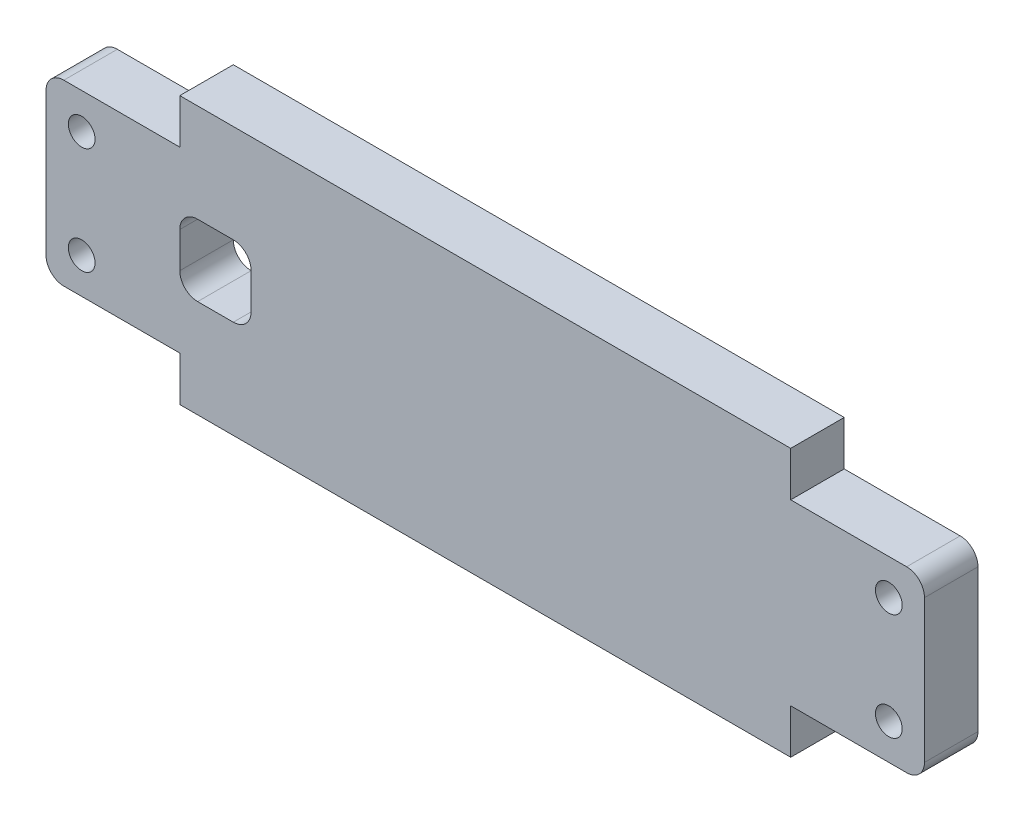
ISO-10303-21;
HEADER;
FILE_DESCRIPTION(('STEP AP214'),'2;1');
FILE_NAME('part.step','',(''),(''),'','','');
FILE_SCHEMA(('AUTOMOTIVE_DESIGN { 1 0 10303 214 1 1 1 1 }'));
ENDSEC;
DATA;
#1=APPLICATION_CONTEXT('core data for automotive mechanical design processes');
#2=APPLICATION_PROTOCOL_DEFINITION('international standard','automotive_design',2000,#1);
#3=PRODUCT_CONTEXT('',#1,'mechanical');
#4=PRODUCT('Part','Part','',(#3));
#5=PRODUCT_RELATED_PRODUCT_CATEGORY('part','',(#4));
#6=PRODUCT_DEFINITION_FORMATION('','',#4);
#7=PRODUCT_DEFINITION_CONTEXT('part definition',#1,'design');
#8=PRODUCT_DEFINITION('design','',#6,#7);
#9=PRODUCT_DEFINITION_SHAPE('','',#8);
#10=(LENGTH_UNIT() NAMED_UNIT(*) SI_UNIT(.MILLI.,.METRE.));
#11=(NAMED_UNIT(*) PLANE_ANGLE_UNIT() SI_UNIT($,.RADIAN.));
#12=(NAMED_UNIT(*) SI_UNIT($,.STERADIAN.) SOLID_ANGLE_UNIT());
#13=UNCERTAINTY_MEASURE_WITH_UNIT(LENGTH_MEASURE(1.E-05),#10,'distance_accuracy_value','');
#14=(GEOMETRIC_REPRESENTATION_CONTEXT(3) GLOBAL_UNCERTAINTY_ASSIGNED_CONTEXT((#13)) GLOBAL_UNIT_ASSIGNED_CONTEXT((#10,
#11,#12)) REPRESENTATION_CONTEXT('',''));
#15=CARTESIAN_POINT('',(0.,0.,0.));
#16=DIRECTION('',(0.,0.,1.));
#17=DIRECTION('',(1.,0.,0.));
#18=AXIS2_PLACEMENT_3D('',#15,#16,#17);
#19=CARTESIAN_POINT('',(0.,0.,3.));
#20=DIRECTION('',(0.,0.,1.));
#21=DIRECTION('',(1.,0.,0.));
#22=AXIS2_PLACEMENT_3D('',#19,#20,#21);
#23=PLANE('',#22);
#24=CARTESIAN_POINT('',(-45.25,6.,3.));
#25=DIRECTION('',(0.,0.,-1.));
#26=DIRECTION('',(-1.,0.,0.));
#27=AXIS2_PLACEMENT_3D('',#24,#25,#26);
#28=CIRCLE('',#27,1.5);
#29=CARTESIAN_POINT('',(-43.75,6.,3.));
#30=VERTEX_POINT('',#29);
#31=EDGE_CURVE('E266',#30,#30,#28,.T.);
#32=ORIENTED_EDGE('',*,*,#31,.T.);
#33=EDGE_LOOP('',(#32));
#34=FACE_BOUND('',#33,.T.);
#35=CARTESIAN_POINT('',(-45.25,-6.,3.));
#36=DIRECTION('',(0.,0.,-1.));
#37=DIRECTION('',(-1.,0.,0.));
#38=AXIS2_PLACEMENT_3D('',#35,#36,#37);
#39=CIRCLE('',#38,1.5);
#40=CARTESIAN_POINT('',(-43.75,-6.,3.));
#41=VERTEX_POINT('',#40);
#42=EDGE_CURVE('E251',#41,#41,#39,.T.);
#43=ORIENTED_EDGE('',*,*,#42,.T.);
#44=EDGE_LOOP('',(#43));
#45=FACE_BOUND('',#44,.T.);
#46=CARTESIAN_POINT('',(45.25,-6.,3.));
#47=DIRECTION('',(0.,0.,-1.));
#48=DIRECTION('',(-1.,0.,0.));
#49=AXIS2_PLACEMENT_3D('',#46,#47,#48);
#50=CIRCLE('',#49,1.5);
#51=CARTESIAN_POINT('',(46.75,-6.,3.));
#52=VERTEX_POINT('',#51);
#53=EDGE_CURVE('E255',#52,#52,#50,.T.);
#54=ORIENTED_EDGE('',*,*,#53,.T.);
#55=EDGE_LOOP('',(#54));
#56=FACE_BOUND('',#55,.T.);
#57=CARTESIAN_POINT('',(45.25,6.,3.));
#58=DIRECTION('',(0.,0.,-1.));
#59=DIRECTION('',(-1.,0.,0.));
#60=AXIS2_PLACEMENT_3D('',#57,#58,#59);
#61=CIRCLE('',#60,1.5);
#62=CARTESIAN_POINT('',(46.75,6.,3.));
#63=VERTEX_POINT('',#62);
#64=EDGE_CURVE('E392',#63,#63,#61,.T.);
#65=ORIENTED_EDGE('',*,*,#64,.T.);
#66=EDGE_LOOP('',(#65));
#67=FACE_BOUND('',#66,.T.);
#68=DIRECTION('',(0.,1.,0.));
#69=VECTOR('',#68,1.);
#70=CARTESIAN_POINT('',(-34.25,2.,3.));
#71=LINE('',#70,#69);
#72=CARTESIAN_POINT('',(-34.25,-2.,3.));
#73=VERTEX_POINT('',#72);
#74=CARTESIAN_POINT('',(-34.25,2.,3.));
#75=VERTEX_POINT('',#74);
#76=EDGE_CURVE('E424',#73,#75,#71,.T.);
#77=ORIENTED_EDGE('',*,*,#76,.T.);
#78=CARTESIAN_POINT('',(-32.25,2.,3.));
#79=DIRECTION('',(0.,0.,1.));
#80=DIRECTION('',(-0.707106781186548,0.707106781186547,0.));
#81=AXIS2_PLACEMENT_3D('',#78,#79,#80);
#82=CIRCLE('',#81,2.);
#83=CARTESIAN_POINT('',(-32.25,4.,3.));
#84=VERTEX_POINT('',#83);
#85=EDGE_CURVE('E281',#84,#75,#82,.T.);
#86=ORIENTED_EDGE('',*,*,#85,.F.);
#87=DIRECTION('',(1.,0.,0.));
#88=VECTOR('',#87,1.);
#89=CARTESIAN_POINT('',(-13.125,4.,3.));
#90=LINE('',#89,#88);
#91=CARTESIAN_POINT('',(-28.25,4.,3.));
#92=VERTEX_POINT('',#91);
#93=EDGE_CURVE('E389',#84,#92,#90,.T.);
#94=ORIENTED_EDGE('',*,*,#93,.T.);
#95=CARTESIAN_POINT('',(-28.25,2.,3.));
#96=DIRECTION('',(0.,0.,1.));
#97=DIRECTION('',(0.707106781186548,0.707106781186547,0.));
#98=AXIS2_PLACEMENT_3D('',#95,#96,#97);
#99=CIRCLE('',#98,2.);
#100=CARTESIAN_POINT('',(-26.25,2.,3.));
#101=VERTEX_POINT('',#100);
#102=EDGE_CURVE('E351',#101,#92,#99,.T.);
#103=ORIENTED_EDGE('',*,*,#102,.F.);
#104=DIRECTION('',(0.,-1.,0.));
#105=VECTOR('',#104,1.);
#106=CARTESIAN_POINT('',(-26.25,-2.,3.));
#107=LINE('',#106,#105);
#108=CARTESIAN_POINT('',(-26.25,-2.,3.));
#109=VERTEX_POINT('',#108);
#110=EDGE_CURVE('E275',#101,#109,#107,.T.);
#111=ORIENTED_EDGE('',*,*,#110,.T.);
#112=CARTESIAN_POINT('',(-28.25,-2.,3.));
#113=DIRECTION('',(0.,0.,1.));
#114=DIRECTION('',(0.707106781186548,-0.707106781186547,0.));
#115=AXIS2_PLACEMENT_3D('',#112,#113,#114);
#116=CIRCLE('',#115,2.);
#117=CARTESIAN_POINT('',(-28.25,-4.,3.));
#118=VERTEX_POINT('',#117);
#119=EDGE_CURVE('E352',#118,#109,#116,.T.);
#120=ORIENTED_EDGE('',*,*,#119,.F.);
#121=DIRECTION('',(-1.,0.,0.));
#122=VECTOR('',#121,1.);
#123=CARTESIAN_POINT('',(-17.125,-4.,3.));
#124=LINE('',#123,#122);
#125=CARTESIAN_POINT('',(-32.25,-4.,3.));
#126=VERTEX_POINT('',#125);
#127=EDGE_CURVE('E282',#118,#126,#124,.T.);
#128=ORIENTED_EDGE('',*,*,#127,.T.);
#129=CARTESIAN_POINT('',(-32.25,-2.,3.));
#130=DIRECTION('',(0.,0.,1.));
#131=DIRECTION('',(-0.707106781186548,-0.707106781186547,0.));
#132=AXIS2_PLACEMENT_3D('',#129,#130,#131);
#133=CIRCLE('',#132,2.);
#134=EDGE_CURVE('E388',#73,#126,#133,.T.);
#135=ORIENTED_EDGE('',*,*,#134,.F.);
#136=EDGE_LOOP('',(#77,#86,#94,#103,#111,#120,#128,#135));
#137=FACE_BOUND('',#136,.T.);
#138=CARTESIAN_POINT('',(47.25,8.,3.));
#139=DIRECTION('',(0.,0.,-1.));
#140=DIRECTION('',(0.70710678118655,0.707106781186545,0.));
#141=AXIS2_PLACEMENT_3D('',#138,#139,#140);
#142=CIRCLE('',#141,2.);
#143=CARTESIAN_POINT('',(47.25,10.,3.));
#144=VERTEX_POINT('',#143);
#145=CARTESIAN_POINT('',(49.25,8.,3.));
#146=VERTEX_POINT('',#145);
#147=EDGE_CURVE('E309',#144,#146,#142,.T.);
#148=ORIENTED_EDGE('',*,*,#147,.F.);
#149=DIRECTION('',(-1.,0.,0.));
#150=VECTOR('',#149,1.);
#151=CARTESIAN_POINT('',(49.25,10.,3.));
#152=LINE('',#151,#150);
#153=CARTESIAN_POINT('',(34.25,10.,3.));
#154=VERTEX_POINT('',#153);
#155=EDGE_CURVE('E445',#144,#154,#152,.T.);
#156=ORIENTED_EDGE('',*,*,#155,.T.);
#157=DIRECTION('',(0.,1.,0.));
#158=VECTOR('',#157,1.);
#159=CARTESIAN_POINT('',(34.25,-15.,3.));
#160=LINE('',#159,#158);
#161=CARTESIAN_POINT('',(34.25,15.,3.));
#162=VERTEX_POINT('',#161);
#163=EDGE_CURVE('E313',#154,#162,#160,.T.);
#164=ORIENTED_EDGE('',*,*,#163,.T.);
#165=DIRECTION('',(-1.,0.,0.));
#166=VECTOR('',#165,1.);
#167=CARTESIAN_POINT('',(34.25,15.,3.));
#168=LINE('',#167,#166);
#169=CARTESIAN_POINT('',(-34.25,15.,3.));
#170=VERTEX_POINT('',#169);
#171=EDGE_CURVE('E497',#162,#170,#168,.T.);
#172=ORIENTED_EDGE('',*,*,#171,.T.);
#173=DIRECTION('',(0.,-1.,0.));
#174=VECTOR('',#173,1.);
#175=CARTESIAN_POINT('',(-34.25,15.,3.));
#176=LINE('',#175,#174);
#177=CARTESIAN_POINT('',(-34.25,10.,3.));
#178=VERTEX_POINT('',#177);
#179=EDGE_CURVE('E462',#170,#178,#176,.T.);
#180=ORIENTED_EDGE('',*,*,#179,.T.);
#181=DIRECTION('',(-1.,0.,0.));
#182=VECTOR('',#181,1.);
#183=CARTESIAN_POINT('',(-34.25,10.,3.));
#184=LINE('',#183,#182);
#185=CARTESIAN_POINT('',(-47.25,10.,3.));
#186=VERTEX_POINT('',#185);
#187=EDGE_CURVE('E287',#178,#186,#184,.T.);
#188=ORIENTED_EDGE('',*,*,#187,.T.);
#189=CARTESIAN_POINT('',(-47.25,8.,3.));
#190=DIRECTION('',(0.,0.,-1.));
#191=DIRECTION('',(-0.70710678118655,0.707106781186545,0.));
#192=AXIS2_PLACEMENT_3D('',#189,#190,#191);
#193=CIRCLE('',#192,2.);
#194=CARTESIAN_POINT('',(-49.25,8.,3.));
#195=VERTEX_POINT('',#194);
#196=EDGE_CURVE('E307',#195,#186,#193,.T.);
#197=ORIENTED_EDGE('',*,*,#196,.F.);
#198=DIRECTION('',(0.,-1.,0.));
#199=VECTOR('',#198,1.);
#200=CARTESIAN_POINT('',(-49.25,10.,3.));
#201=LINE('',#200,#199);
#202=CARTESIAN_POINT('',(-49.25,-8.,3.));
#203=VERTEX_POINT('',#202);
#204=EDGE_CURVE('E308',#195,#203,#201,.T.);
#205=ORIENTED_EDGE('',*,*,#204,.T.);
#206=CARTESIAN_POINT('',(-47.25,-8.,3.));
#207=DIRECTION('',(0.,0.,-1.));
#208=DIRECTION('',(-0.707106781186546,-0.707106781186549,0.));
#209=AXIS2_PLACEMENT_3D('',#206,#207,#208);
#210=CIRCLE('',#209,2.);
#211=CARTESIAN_POINT('',(-47.25,-10.,3.));
#212=VERTEX_POINT('',#211);
#213=EDGE_CURVE('E367',#212,#203,#210,.T.);
#214=ORIENTED_EDGE('',*,*,#213,.F.);
#215=DIRECTION('',(1.,0.,0.));
#216=VECTOR('',#215,1.);
#217=CARTESIAN_POINT('',(-49.25,-10.,3.));
#218=LINE('',#217,#216);
#219=CARTESIAN_POINT('',(-34.25,-10.,3.));
#220=VERTEX_POINT('',#219);
#221=EDGE_CURVE('E10',#212,#220,#218,.T.);
#222=ORIENTED_EDGE('',*,*,#221,.T.);
#223=DIRECTION('',(0.,-1.,0.));
#224=VECTOR('',#223,1.);
#225=CARTESIAN_POINT('',(-34.25,15.,3.));
#226=LINE('',#225,#224);
#227=CARTESIAN_POINT('',(-34.25,-15.,3.));
#228=VERTEX_POINT('',#227);
#229=EDGE_CURVE('E47',#220,#228,#226,.T.);
#230=ORIENTED_EDGE('',*,*,#229,.T.);
#231=DIRECTION('',(1.,0.,0.));
#232=VECTOR('',#231,1.);
#233=CARTESIAN_POINT('',(-34.25,-15.,3.));
#234=LINE('',#233,#232);
#235=CARTESIAN_POINT('',(34.25,-15.,3.));
#236=VERTEX_POINT('',#235);
#237=EDGE_CURVE('E396',#228,#236,#234,.T.);
#238=ORIENTED_EDGE('',*,*,#237,.T.);
#239=DIRECTION('',(0.,1.,0.));
#240=VECTOR('',#239,1.);
#241=CARTESIAN_POINT('',(34.25,-15.,3.));
#242=LINE('',#241,#240);
#243=CARTESIAN_POINT('',(34.25,-10.,3.));
#244=VERTEX_POINT('',#243);
#245=EDGE_CURVE('E328',#236,#244,#242,.T.);
#246=ORIENTED_EDGE('',*,*,#245,.T.);
#247=DIRECTION('',(1.,0.,0.));
#248=VECTOR('',#247,1.);
#249=CARTESIAN_POINT('',(34.25,-10.,3.));
#250=LINE('',#249,#248);
#251=CARTESIAN_POINT('',(47.25,-10.,3.));
#252=VERTEX_POINT('',#251);
#253=EDGE_CURVE('E372',#244,#252,#250,.T.);
#254=ORIENTED_EDGE('',*,*,#253,.T.);
#255=CARTESIAN_POINT('',(47.25,-8.,3.));
#256=DIRECTION('',(0.,0.,-1.));
#257=DIRECTION('',(0.707106781186546,-0.707106781186549,0.));
#258=AXIS2_PLACEMENT_3D('',#255,#256,#257);
#259=CIRCLE('',#258,2.);
#260=CARTESIAN_POINT('',(49.25,-8.,3.));
#261=VERTEX_POINT('',#260);
#262=EDGE_CURVE('E270',#261,#252,#259,.T.);
#263=ORIENTED_EDGE('',*,*,#262,.F.);
#264=DIRECTION('',(0.,1.,0.));
#265=VECTOR('',#264,1.);
#266=CARTESIAN_POINT('',(49.25,-10.,3.));
#267=LINE('',#266,#265);
#268=EDGE_CURVE('E414',#261,#146,#267,.T.);
#269=ORIENTED_EDGE('',*,*,#268,.T.);
#270=EDGE_LOOP('',(#148,#156,#164,#172,#180,#188,#197,#205,#214,#222,#230,#238,#246,#254,#263,#269));
#271=FACE_BOUND('',#270,.T.);
#272=ADVANCED_FACE('F16',(#34,#45,#56,#67,#137,#271),#23,.T.);
#273=CARTESIAN_POINT('',(-49.25,-10.,0.));
#274=DIRECTION('',(0.,-1.,0.));
#275=DIRECTION('',(0.,0.,-1.));
#276=AXIS2_PLACEMENT_3D('',#273,#274,#275);
#277=PLANE('',#276);
#278=DIRECTION('',(0.,0.,1.));
#279=VECTOR('',#278,1.);
#280=CARTESIAN_POINT('',(-47.25,-10.,0.));
#281=LINE('',#280,#279);
#282=CARTESIAN_POINT('',(-47.25,-10.,-3.));
#283=VERTEX_POINT('',#282);
#284=EDGE_CURVE('E363',#283,#212,#281,.T.);
#285=ORIENTED_EDGE('',*,*,#284,.F.);
#286=DIRECTION('',(-1.,0.,0.));
#287=VECTOR('',#286,1.);
#288=CARTESIAN_POINT('',(-49.25,-10.,-3.));
#289=LINE('',#288,#287);
#290=CARTESIAN_POINT('',(-34.25,-10.,-3.));
#291=VERTEX_POINT('',#290);
#292=EDGE_CURVE('E337',#291,#283,#289,.T.);
#293=ORIENTED_EDGE('',*,*,#292,.F.);
#294=DIRECTION('',(0.,0.,1.));
#295=VECTOR('',#294,1.);
#296=CARTESIAN_POINT('',(-34.25,-10.,0.));
#297=LINE('',#296,#295);
#298=EDGE_CURVE('E26',#291,#220,#297,.T.);
#299=ORIENTED_EDGE('',*,*,#298,.T.);
#300=ORIENTED_EDGE('',*,*,#221,.F.);
#301=EDGE_LOOP('',(#285,#293,#299,#300));
#302=FACE_BOUND('',#301,.T.);
#303=ADVANCED_FACE('F568',(#302),#277,.T.);
#304=CARTESIAN_POINT('',(-34.25,-10.,0.));
#305=DIRECTION('',(-1.,0.,0.));
#306=DIRECTION('',(0.,1.,0.));
#307=AXIS2_PLACEMENT_3D('',#304,#305,#306);
#308=PLANE('',#307);
#309=DIRECTION('',(0.,0.,1.));
#310=VECTOR('',#309,1.);
#311=CARTESIAN_POINT('',(-34.25,-15.,0.));
#312=LINE('',#311,#310);
#313=CARTESIAN_POINT('',(-34.25,-15.,-3.));
#314=VERTEX_POINT('',#313);
#315=EDGE_CURVE('E405',#314,#228,#312,.T.);
#316=ORIENTED_EDGE('',*,*,#315,.T.);
#317=ORIENTED_EDGE('',*,*,#229,.F.);
#318=ORIENTED_EDGE('',*,*,#298,.F.);
#319=DIRECTION('',(0.,1.,0.));
#320=VECTOR('',#319,1.);
#321=CARTESIAN_POINT('',(-34.25,15.,-3.));
#322=LINE('',#321,#320);
#323=EDGE_CURVE('E342',#314,#291,#322,.T.);
#324=ORIENTED_EDGE('',*,*,#323,.F.);
#325=EDGE_LOOP('',(#316,#317,#318,#324));
#326=FACE_BOUND('',#325,.T.);
#327=ADVANCED_FACE('F574',(#326),#308,.T.);
#328=CARTESIAN_POINT('',(-34.25,-15.,0.));
#329=DIRECTION('',(0.,-1.,0.));
#330=DIRECTION('',(-1.,0.,0.));
#331=AXIS2_PLACEMENT_3D('',#328,#329,#330);
#332=PLANE('',#331);
#333=DIRECTION('',(0.,0.,1.));
#334=VECTOR('',#333,1.);
#335=CARTESIAN_POINT('',(34.25,-15.,0.));
#336=LINE('',#335,#334);
#337=CARTESIAN_POINT('',(34.25,-15.,-3.));
#338=VERTEX_POINT('',#337);
#339=EDGE_CURVE('E332',#338,#236,#336,.T.);
#340=ORIENTED_EDGE('',*,*,#339,.T.);
#341=ORIENTED_EDGE('',*,*,#237,.F.);
#342=ORIENTED_EDGE('',*,*,#315,.F.);
#343=DIRECTION('',(-1.,0.,0.));
#344=VECTOR('',#343,1.);
#345=CARTESIAN_POINT('',(-34.25,-15.,-3.));
#346=LINE('',#345,#344);
#347=EDGE_CURVE('E413',#338,#314,#346,.T.);
#348=ORIENTED_EDGE('',*,*,#347,.F.);
#349=EDGE_LOOP('',(#340,#341,#342,#348));
#350=FACE_BOUND('',#349,.T.);
#351=ADVANCED_FACE('F640',(#350),#332,.T.);
#352=CARTESIAN_POINT('',(34.25,-15.,0.));
#353=DIRECTION('',(1.,0.,0.));
#354=DIRECTION('',(0.,1.,0.));
#355=AXIS2_PLACEMENT_3D('',#352,#353,#354);
#356=PLANE('',#355);
#357=DIRECTION('',(0.,0.,1.));
#358=VECTOR('',#357,1.);
#359=CARTESIAN_POINT('',(34.25,-10.,0.));
#360=LINE('',#359,#358);
#361=CARTESIAN_POINT('',(34.25,-10.,-3.));
#362=VERTEX_POINT('',#361);
#363=EDGE_CURVE('E333',#362,#244,#360,.T.);
#364=ORIENTED_EDGE('',*,*,#363,.T.);
#365=ORIENTED_EDGE('',*,*,#245,.F.);
#366=ORIENTED_EDGE('',*,*,#339,.F.);
#367=DIRECTION('',(0.,-1.,0.));
#368=VECTOR('',#367,1.);
#369=CARTESIAN_POINT('',(34.25,-15.,-3.));
#370=LINE('',#369,#368);
#371=EDGE_CURVE('E20',#362,#338,#370,.T.);
#372=ORIENTED_EDGE('',*,*,#371,.F.);
#373=EDGE_LOOP('',(#364,#365,#366,#372));
#374=FACE_BOUND('',#373,.T.);
#375=ADVANCED_FACE('F690',(#374),#356,.T.);
#376=CARTESIAN_POINT('',(34.25,-10.,0.));
#377=DIRECTION('',(0.,-1.,0.));
#378=DIRECTION('',(-1.,0.,0.));
#379=AXIS2_PLACEMENT_3D('',#376,#377,#378);
#380=PLANE('',#379);
#381=DIRECTION('',(0.,0.,-1.));
#382=VECTOR('',#381,1.);
#383=CARTESIAN_POINT('',(47.25,-10.,0.));
#384=LINE('',#383,#382);
#385=CARTESIAN_POINT('',(47.25,-10.,-3.));
#386=VERTEX_POINT('',#385);
#387=EDGE_CURVE('E368',#252,#386,#384,.T.);
#388=ORIENTED_EDGE('',*,*,#387,.F.);
#389=ORIENTED_EDGE('',*,*,#253,.F.);
#390=ORIENTED_EDGE('',*,*,#363,.F.);
#391=DIRECTION('',(-1.,0.,0.));
#392=VECTOR('',#391,1.);
#393=CARTESIAN_POINT('',(34.25,-10.,-3.));
#394=LINE('',#393,#392);
#395=EDGE_CURVE('E409',#386,#362,#394,.T.);
#396=ORIENTED_EDGE('',*,*,#395,.F.);
#397=EDGE_LOOP('',(#388,#389,#390,#396));
#398=FACE_BOUND('',#397,.T.);
#399=ADVANCED_FACE('F18',(#398),#380,.T.);
#400=CARTESIAN_POINT('',(49.25,10.,0.));
#401=DIRECTION('',(0.,1.,0.));
#402=DIRECTION('',(1.,0.,0.));
#403=AXIS2_PLACEMENT_3D('',#400,#401,#402);
#404=PLANE('',#403);
#405=DIRECTION('',(0.,0.,1.));
#406=VECTOR('',#405,1.);
#407=CARTESIAN_POINT('',(47.25,10.,0.));
#408=LINE('',#407,#406);
#409=CARTESIAN_POINT('',(47.25,10.,-3.));
#410=VERTEX_POINT('',#409);
#411=EDGE_CURVE('E297',#410,#144,#408,.T.);
#412=ORIENTED_EDGE('',*,*,#411,.F.);
#413=DIRECTION('',(1.,0.,0.));
#414=VECTOR('',#413,1.);
#415=CARTESIAN_POINT('',(49.25,10.,-3.));
#416=LINE('',#415,#414);
#417=CARTESIAN_POINT('',(34.25,10.,-3.));
#418=VERTEX_POINT('',#417);
#419=EDGE_CURVE('E362',#418,#410,#416,.T.);
#420=ORIENTED_EDGE('',*,*,#419,.F.);
#421=DIRECTION('',(0.,0.,1.));
#422=VECTOR('',#421,1.);
#423=CARTESIAN_POINT('',(34.25,10.,0.));
#424=LINE('',#423,#422);
#425=EDGE_CURVE('E316',#418,#154,#424,.T.);
#426=ORIENTED_EDGE('',*,*,#425,.T.);
#427=ORIENTED_EDGE('',*,*,#155,.F.);
#428=EDGE_LOOP('',(#412,#420,#426,#427));
#429=FACE_BOUND('',#428,.T.);
#430=ADVANCED_FACE('F579',(#429),#404,.T.);
#431=CARTESIAN_POINT('',(34.25,10.,0.));
#432=DIRECTION('',(1.,0.,0.));
#433=DIRECTION('',(0.,1.,0.));
#434=AXIS2_PLACEMENT_3D('',#431,#432,#433);
#435=PLANE('',#434);
#436=DIRECTION('',(0.,0.,1.));
#437=VECTOR('',#436,1.);
#438=CARTESIAN_POINT('',(34.25,15.,0.));
#439=LINE('',#438,#437);
#440=CARTESIAN_POINT('',(34.25,15.,-3.));
#441=VERTEX_POINT('',#440);
#442=EDGE_CURVE('E317',#441,#162,#439,.T.);
#443=ORIENTED_EDGE('',*,*,#442,.T.);
#444=ORIENTED_EDGE('',*,*,#163,.F.);
#445=ORIENTED_EDGE('',*,*,#425,.F.);
#446=DIRECTION('',(0.,-1.,0.));
#447=VECTOR('',#446,1.);
#448=CARTESIAN_POINT('',(34.25,-15.,-3.));
#449=LINE('',#448,#447);
#450=EDGE_CURVE('E483',#441,#418,#449,.T.);
#451=ORIENTED_EDGE('',*,*,#450,.F.);
#452=EDGE_LOOP('',(#443,#444,#445,#451));
#453=FACE_BOUND('',#452,.T.);
#454=ADVANCED_FACE('F627',(#453),#435,.T.);
#455=CARTESIAN_POINT('',(34.25,15.,0.));
#456=DIRECTION('',(0.,1.,0.));
#457=DIRECTION('',(1.,0.,0.));
#458=AXIS2_PLACEMENT_3D('',#455,#456,#457);
#459=PLANE('',#458);
#460=DIRECTION('',(0.,0.,1.));
#461=VECTOR('',#460,1.);
#462=CARTESIAN_POINT('',(-34.25,15.,0.));
#463=LINE('',#462,#461);
#464=CARTESIAN_POINT('',(-34.25,15.,-3.));
#465=VERTEX_POINT('',#464);
#466=EDGE_CURVE('E465',#465,#170,#463,.T.);
#467=ORIENTED_EDGE('',*,*,#466,.T.);
#468=ORIENTED_EDGE('',*,*,#171,.F.);
#469=ORIENTED_EDGE('',*,*,#442,.F.);
#470=DIRECTION('',(1.,0.,0.));
#471=VECTOR('',#470,1.);
#472=CARTESIAN_POINT('',(34.25,15.,-3.));
#473=LINE('',#472,#471);
#474=EDGE_CURVE('E474',#465,#441,#473,.T.);
#475=ORIENTED_EDGE('',*,*,#474,.F.);
#476=EDGE_LOOP('',(#467,#468,#469,#475));
#477=FACE_BOUND('',#476,.T.);
#478=ADVANCED_FACE('F606',(#477),#459,.T.);
#479=CARTESIAN_POINT('',(-34.25,15.,0.));
#480=DIRECTION('',(-1.,0.,0.));
#481=DIRECTION('',(0.,1.,0.));
#482=AXIS2_PLACEMENT_3D('',#479,#480,#481);
#483=PLANE('',#482);
#484=DIRECTION('',(0.,0.,1.));
#485=VECTOR('',#484,1.);
#486=CARTESIAN_POINT('',(-34.25,10.,0.));
#487=LINE('',#486,#485);
#488=CARTESIAN_POINT('',(-34.25,10.,-3.));
#489=VERTEX_POINT('',#488);
#490=EDGE_CURVE('E290',#489,#178,#487,.T.);
#491=ORIENTED_EDGE('',*,*,#490,.T.);
#492=ORIENTED_EDGE('',*,*,#179,.F.);
#493=ORIENTED_EDGE('',*,*,#466,.F.);
#494=DIRECTION('',(0.,1.,0.));
#495=VECTOR('',#494,1.);
#496=CARTESIAN_POINT('',(-34.25,15.,-3.));
#497=LINE('',#496,#495);
#498=EDGE_CURVE('E471',#489,#465,#497,.T.);
#499=ORIENTED_EDGE('',*,*,#498,.F.);
#500=EDGE_LOOP('',(#491,#492,#493,#499));
#501=FACE_BOUND('',#500,.T.);
#502=ADVANCED_FACE('F602',(#501),#483,.T.);
#503=CARTESIAN_POINT('',(-34.25,10.,0.));
#504=DIRECTION('',(0.,1.,0.));
#505=DIRECTION('',(1.,0.,0.));
#506=AXIS2_PLACEMENT_3D('',#503,#504,#505);
#507=PLANE('',#506);
#508=DIRECTION('',(0.,0.,-1.));
#509=VECTOR('',#508,1.);
#510=CARTESIAN_POINT('',(-47.25,10.,0.));
#511=LINE('',#510,#509);
#512=CARTESIAN_POINT('',(-47.25,10.,-3.));
#513=VERTEX_POINT('',#512);
#514=EDGE_CURVE('E318',#186,#513,#511,.T.);
#515=ORIENTED_EDGE('',*,*,#514,.F.);
#516=ORIENTED_EDGE('',*,*,#187,.F.);
#517=ORIENTED_EDGE('',*,*,#490,.F.);
#518=DIRECTION('',(1.,0.,0.));
#519=VECTOR('',#518,1.);
#520=CARTESIAN_POINT('',(-34.25,10.,-3.));
#521=LINE('',#520,#519);
#522=EDGE_CURVE('E326',#513,#489,#521,.T.);
#523=ORIENTED_EDGE('',*,*,#522,.F.);
#524=EDGE_LOOP('',(#515,#516,#517,#523));
#525=FACE_BOUND('',#524,.T.);
#526=ADVANCED_FACE('F605',(#525),#507,.T.);
#527=CARTESIAN_POINT('',(45.25,6.,0.));
#528=DIRECTION('',(0.,0.,1.));
#529=DIRECTION('',(-1.,0.,0.));
#530=AXIS2_PLACEMENT_3D('',#527,#528,#529);
#531=CYLINDRICAL_SURFACE('',#530,1.5);
#532=ORIENTED_EDGE('',*,*,#64,.F.);
#533=DIRECTION('',(0.,0.,-1.));
#534=VECTOR('',#533,1.);
#535=CARTESIAN_POINT('',(46.75,6.,0.));
#536=LINE('',#535,#534);
#537=CARTESIAN_POINT('',(46.75,6.,-3.));
#538=VERTEX_POINT('',#537);
#539=EDGE_CURVE('E291',#63,#538,#536,.T.);
#540=ORIENTED_EDGE('',*,*,#539,.T.);
#541=CARTESIAN_POINT('',(45.25,6.,-3.));
#542=DIRECTION('',(0.,0.,1.));
#543=DIRECTION('',(-1.,0.,0.));
#544=AXIS2_PLACEMENT_3D('',#541,#542,#543);
#545=CIRCLE('',#544,1.5);
#546=EDGE_CURVE('E451',#538,#538,#545,.T.);
#547=ORIENTED_EDGE('',*,*,#546,.F.);
#548=ORIENTED_EDGE('',*,*,#539,.F.);
#549=EDGE_LOOP('',(#532,#540,#547,#548));
#550=FACE_BOUND('',#549,.T.);
#551=ADVANCED_FACE('F600',(#550),#531,.F.);
#552=CARTESIAN_POINT('',(45.25,-6.,0.));
#553=DIRECTION('',(0.,0.,1.));
#554=DIRECTION('',(-1.,0.,0.));
#555=AXIS2_PLACEMENT_3D('',#552,#553,#554);
#556=CYLINDRICAL_SURFACE('',#555,1.5);
#557=ORIENTED_EDGE('',*,*,#53,.F.);
#558=DIRECTION('',(0.,0.,-1.));
#559=VECTOR('',#558,1.);
#560=CARTESIAN_POINT('',(46.75,-6.,0.));
#561=LINE('',#560,#559);
#562=CARTESIAN_POINT('',(46.75,-6.,-3.));
#563=VERTEX_POINT('',#562);
#564=EDGE_CURVE('E435',#52,#563,#561,.T.);
#565=ORIENTED_EDGE('',*,*,#564,.T.);
#566=CARTESIAN_POINT('',(45.25,-6.,-3.));
#567=DIRECTION('',(0.,0.,1.));
#568=DIRECTION('',(-1.,0.,0.));
#569=AXIS2_PLACEMENT_3D('',#566,#567,#568);
#570=CIRCLE('',#569,1.5);
#571=EDGE_CURVE('E455',#563,#563,#570,.T.);
#572=ORIENTED_EDGE('',*,*,#571,.F.);
#573=ORIENTED_EDGE('',*,*,#564,.F.);
#574=EDGE_LOOP('',(#557,#565,#572,#573));
#575=FACE_BOUND('',#574,.T.);
#576=ADVANCED_FACE('F597',(#575),#556,.F.);
#577=CARTESIAN_POINT('',(-45.25,-6.,0.));
#578=DIRECTION('',(0.,0.,1.));
#579=DIRECTION('',(-1.,0.,0.));
#580=AXIS2_PLACEMENT_3D('',#577,#578,#579);
#581=CYLINDRICAL_SURFACE('',#580,1.5);
#582=ORIENTED_EDGE('',*,*,#42,.F.);
#583=DIRECTION('',(0.,0.,-1.));
#584=VECTOR('',#583,1.);
#585=CARTESIAN_POINT('',(-43.75,-6.,0.));
#586=LINE('',#585,#584);
#587=CARTESIAN_POINT('',(-43.75,-6.,-3.));
#588=VERTEX_POINT('',#587);
#589=EDGE_CURVE('E248',#41,#588,#586,.T.);
#590=ORIENTED_EDGE('',*,*,#589,.T.);
#591=CARTESIAN_POINT('',(-45.25,-6.,-3.));
#592=DIRECTION('',(0.,0.,1.));
#593=DIRECTION('',(-1.,0.,0.));
#594=AXIS2_PLACEMENT_3D('',#591,#592,#593);
#595=CIRCLE('',#594,1.5);
#596=EDGE_CURVE('E253',#588,#588,#595,.T.);
#597=ORIENTED_EDGE('',*,*,#596,.F.);
#598=ORIENTED_EDGE('',*,*,#589,.F.);
#599=EDGE_LOOP('',(#582,#590,#597,#598));
#600=FACE_BOUND('',#599,.T.);
#601=ADVANCED_FACE('F250',(#600),#581,.F.);
#602=CARTESIAN_POINT('',(-45.25,6.,0.));
#603=DIRECTION('',(0.,0.,1.));
#604=DIRECTION('',(-1.,0.,0.));
#605=AXIS2_PLACEMENT_3D('',#602,#603,#604);
#606=CYLINDRICAL_SURFACE('',#605,1.5);
#607=ORIENTED_EDGE('',*,*,#31,.F.);
#608=DIRECTION('',(0.,0.,-1.));
#609=VECTOR('',#608,1.);
#610=CARTESIAN_POINT('',(-43.75,6.,0.));
#611=LINE('',#610,#609);
#612=CARTESIAN_POINT('',(-43.75,6.,-3.));
#613=VERTEX_POINT('',#612);
#614=EDGE_CURVE('E260',#30,#613,#611,.T.);
#615=ORIENTED_EDGE('',*,*,#614,.T.);
#616=CARTESIAN_POINT('',(-45.25,6.,-3.));
#617=DIRECTION('',(0.,0.,1.));
#618=DIRECTION('',(-1.,0.,0.));
#619=AXIS2_PLACEMENT_3D('',#616,#617,#618);
#620=CIRCLE('',#619,1.5);
#621=EDGE_CURVE('E418',#613,#613,#620,.T.);
#622=ORIENTED_EDGE('',*,*,#621,.F.);
#623=ORIENTED_EDGE('',*,*,#614,.F.);
#624=EDGE_LOOP('',(#607,#615,#622,#623));
#625=FACE_BOUND('',#624,.T.);
#626=ADVANCED_FACE('F565',(#625),#606,.F.);
#627=CARTESIAN_POINT('',(-34.25,4.,-3.));
#628=DIRECTION('',(-1.,0.,0.));
#629=DIRECTION('',(0.,0.,1.));
#630=AXIS2_PLACEMENT_3D('',#627,#628,#629);
#631=PLANE('',#630);
#632=DIRECTION('',(0.,0.,-1.));
#633=VECTOR('',#632,1.);
#634=CARTESIAN_POINT('',(-34.25,2.,-3.));
#635=LINE('',#634,#633);
#636=CARTESIAN_POINT('',(-34.25,2.,-3.));
#637=VERTEX_POINT('',#636);
#638=EDGE_CURVE('E286',#75,#637,#635,.T.);
#639=ORIENTED_EDGE('',*,*,#638,.F.);
#640=ORIENTED_EDGE('',*,*,#76,.F.);
#641=DIRECTION('',(0.,0.,1.));
#642=VECTOR('',#641,1.);
#643=CARTESIAN_POINT('',(-34.25,-2.,-3.));
#644=LINE('',#643,#642);
#645=CARTESIAN_POINT('',(-34.25,-2.,-3.));
#646=VERTEX_POINT('',#645);
#647=EDGE_CURVE('E384',#646,#73,#644,.T.);
#648=ORIENTED_EDGE('',*,*,#647,.F.);
#649=DIRECTION('',(0.,-1.,0.));
#650=VECTOR('',#649,1.);
#651=CARTESIAN_POINT('',(-34.25,2.,-3.));
#652=LINE('',#651,#650);
#653=EDGE_CURVE('E357',#637,#646,#652,.T.);
#654=ORIENTED_EDGE('',*,*,#653,.F.);
#655=EDGE_LOOP('',(#639,#640,#648,#654));
#656=FACE_BOUND('',#655,.T.);
#657=ADVANCED_FACE('F620',(#656),#631,.F.);
#658=CARTESIAN_POINT('',(-32.25,-2.,-3.));
#659=DIRECTION('',(0.,0.,1.));
#660=DIRECTION('',(-0.707106781186548,-0.707106781186547,0.));
#661=AXIS2_PLACEMENT_3D('',#658,#659,#660);
#662=CYLINDRICAL_SURFACE('',#661,2.);
#663=CARTESIAN_POINT('',(-32.25,-2.,-3.));
#664=DIRECTION('',(0.,0.,-1.));
#665=DIRECTION('',(-0.707106781186548,-0.707106781186547,0.));
#666=AXIS2_PLACEMENT_3D('',#663,#664,#665);
#667=CIRCLE('',#666,2.);
#668=CARTESIAN_POINT('',(-32.25,-4.,-3.));
#669=VERTEX_POINT('',#668);
#670=EDGE_CURVE('E361',#669,#646,#667,.T.);
#671=ORIENTED_EDGE('',*,*,#670,.T.);
#672=ORIENTED_EDGE('',*,*,#647,.T.);
#673=ORIENTED_EDGE('',*,*,#134,.T.);
#674=DIRECTION('',(0.,0.,-1.));
#675=VECTOR('',#674,1.);
#676=CARTESIAN_POINT('',(-32.25,-4.,-3.));
#677=LINE('',#676,#675);
#678=EDGE_CURVE('E355',#126,#669,#677,.T.);
#679=ORIENTED_EDGE('',*,*,#678,.T.);
#680=EDGE_LOOP('',(#671,#672,#673,#679));
#681=FACE_BOUND('',#680,.T.);
#682=ADVANCED_FACE('F617',(#681),#662,.F.);
#683=CARTESIAN_POINT('',(-26.25,4.,-3.));
#684=DIRECTION('',(0.,1.,0.));
#685=DIRECTION('',(1.,0.,0.));
#686=AXIS2_PLACEMENT_3D('',#683,#684,#685);
#687=PLANE('',#686);
#688=DIRECTION('',(0.,0.,-1.));
#689=VECTOR('',#688,1.);
#690=CARTESIAN_POINT('',(-28.25,4.,-3.));
#691=LINE('',#690,#689);
#692=CARTESIAN_POINT('',(-28.25,4.,-3.));
#693=VERTEX_POINT('',#692);
#694=EDGE_CURVE('E276',#92,#693,#691,.T.);
#695=ORIENTED_EDGE('',*,*,#694,.F.);
#696=ORIENTED_EDGE('',*,*,#93,.F.);
#697=DIRECTION('',(0.,0.,1.));
#698=VECTOR('',#697,1.);
#699=CARTESIAN_POINT('',(-32.25,4.,-3.));
#700=LINE('',#699,#698);
#701=CARTESIAN_POINT('',(-32.25,4.,-3.));
#702=VERTEX_POINT('',#701);
#703=EDGE_CURVE('E277',#702,#84,#700,.T.);
#704=ORIENTED_EDGE('',*,*,#703,.F.);
#705=DIRECTION('',(-1.,0.,0.));
#706=VECTOR('',#705,1.);
#707=CARTESIAN_POINT('',(-13.125,4.,-3.));
#708=LINE('',#707,#706);
#709=EDGE_CURVE('E378',#693,#702,#708,.T.);
#710=ORIENTED_EDGE('',*,*,#709,.F.);
#711=EDGE_LOOP('',(#695,#696,#704,#710));
#712=FACE_BOUND('',#711,.T.);
#713=ADVANCED_FACE('F615',(#712),#687,.F.);
#714=CARTESIAN_POINT('',(-32.25,2.,-3.));
#715=DIRECTION('',(0.,0.,1.));
#716=DIRECTION('',(-0.707106781186548,0.707106781186547,0.));
#717=AXIS2_PLACEMENT_3D('',#714,#715,#716);
#718=CYLINDRICAL_SURFACE('',#717,2.);
#719=CARTESIAN_POINT('',(-32.25,2.,-3.));
#720=DIRECTION('',(0.,0.,-1.));
#721=DIRECTION('',(-0.707106781186548,0.707106781186547,0.));
#722=AXIS2_PLACEMENT_3D('',#719,#720,#721);
#723=CIRCLE('',#722,2.);
#724=EDGE_CURVE('E441',#637,#702,#723,.T.);
#725=ORIENTED_EDGE('',*,*,#724,.T.);
#726=ORIENTED_EDGE('',*,*,#703,.T.);
#727=ORIENTED_EDGE('',*,*,#85,.T.);
#728=ORIENTED_EDGE('',*,*,#638,.T.);
#729=EDGE_LOOP('',(#725,#726,#727,#728));
#730=FACE_BOUND('',#729,.T.);
#731=ADVANCED_FACE('F611',(#730),#718,.F.);
#732=CARTESIAN_POINT('',(-34.25,-4.,-3.));
#733=DIRECTION('',(0.,-1.,0.));
#734=DIRECTION('',(-1.,0.,0.));
#735=AXIS2_PLACEMENT_3D('',#732,#733,#734);
#736=PLANE('',#735);
#737=DIRECTION('',(0.,0.,1.));
#738=VECTOR('',#737,1.);
#739=CARTESIAN_POINT('',(-28.25,-4.,-3.));
#740=LINE('',#739,#738);
#741=CARTESIAN_POINT('',(-28.25,-4.,-3.));
#742=VERTEX_POINT('',#741);
#743=EDGE_CURVE('E356',#742,#118,#740,.T.);
#744=ORIENTED_EDGE('',*,*,#743,.F.);
#745=DIRECTION('',(1.,0.,0.));
#746=VECTOR('',#745,1.);
#747=CARTESIAN_POINT('',(-17.125,-4.,-3.));
#748=LINE('',#747,#746);
#749=EDGE_CURVE('E459',#669,#742,#748,.T.);
#750=ORIENTED_EDGE('',*,*,#749,.F.);
#751=ORIENTED_EDGE('',*,*,#678,.F.);
#752=ORIENTED_EDGE('',*,*,#127,.F.);
#753=EDGE_LOOP('',(#744,#750,#751,#752));
#754=FACE_BOUND('',#753,.T.);
#755=ADVANCED_FACE('F614',(#754),#736,.F.);
#756=CARTESIAN_POINT('',(-28.25,-2.,-3.));
#757=DIRECTION('',(0.,0.,1.));
#758=DIRECTION('',(0.707106781186548,-0.707106781186547,0.));
#759=AXIS2_PLACEMENT_3D('',#756,#757,#758);
#760=CYLINDRICAL_SURFACE('',#759,2.);
#761=CARTESIAN_POINT('',(-28.25,-2.,-3.));
#762=DIRECTION('',(0.,0.,-1.));
#763=DIRECTION('',(0.707106781186548,-0.707106781186547,0.));
#764=AXIS2_PLACEMENT_3D('',#761,#762,#763);
#765=CIRCLE('',#764,2.);
#766=CARTESIAN_POINT('',(-26.25,-2.,-3.));
#767=VERTEX_POINT('',#766);
#768=EDGE_CURVE('E348',#767,#742,#765,.T.);
#769=ORIENTED_EDGE('',*,*,#768,.T.);
#770=ORIENTED_EDGE('',*,*,#743,.T.);
#771=ORIENTED_EDGE('',*,*,#119,.T.);
#772=DIRECTION('',(0.,0.,-1.));
#773=VECTOR('',#772,1.);
#774=CARTESIAN_POINT('',(-26.25,-2.,-3.));
#775=LINE('',#774,#773);
#776=EDGE_CURVE('E272',#109,#767,#775,.T.);
#777=ORIENTED_EDGE('',*,*,#776,.T.);
#778=EDGE_LOOP('',(#769,#770,#771,#777));
#779=FACE_BOUND('',#778,.T.);
#780=ADVANCED_FACE('F631',(#779),#760,.F.);
#781=CARTESIAN_POINT('',(-26.25,-4.,-3.));
#782=DIRECTION('',(1.,0.,0.));
#783=DIRECTION('',(0.,1.,0.));
#784=AXIS2_PLACEMENT_3D('',#781,#782,#783);
#785=PLANE('',#784);
#786=DIRECTION('',(0.,0.,1.));
#787=VECTOR('',#786,1.);
#788=CARTESIAN_POINT('',(-26.25,2.,-3.));
#789=LINE('',#788,#787);
#790=CARTESIAN_POINT('',(-26.25,2.,-3.));
#791=VERTEX_POINT('',#790);
#792=EDGE_CURVE('E321',#791,#101,#789,.T.);
#793=ORIENTED_EDGE('',*,*,#792,.F.);
#794=DIRECTION('',(0.,1.,0.));
#795=VECTOR('',#794,1.);
#796=CARTESIAN_POINT('',(-26.25,-2.,-3.));
#797=LINE('',#796,#795);
#798=EDGE_CURVE('E343',#767,#791,#797,.T.);
#799=ORIENTED_EDGE('',*,*,#798,.F.);
#800=ORIENTED_EDGE('',*,*,#776,.F.);
#801=ORIENTED_EDGE('',*,*,#110,.F.);
#802=EDGE_LOOP('',(#793,#799,#800,#801));
#803=FACE_BOUND('',#802,.T.);
#804=ADVANCED_FACE('F595',(#803),#785,.F.);
#805=CARTESIAN_POINT('',(-28.25,2.,-3.));
#806=DIRECTION('',(0.,0.,1.));
#807=DIRECTION('',(0.707106781186548,0.707106781186547,0.));
#808=AXIS2_PLACEMENT_3D('',#805,#806,#807);
#809=CYLINDRICAL_SURFACE('',#808,2.);
#810=CARTESIAN_POINT('',(-28.25,2.,-3.));
#811=DIRECTION('',(0.,0.,-1.));
#812=DIRECTION('',(0.707106781186548,0.707106781186547,0.));
#813=AXIS2_PLACEMENT_3D('',#810,#811,#812);
#814=CIRCLE('',#813,2.);
#815=EDGE_CURVE('E347',#693,#791,#814,.T.);
#816=ORIENTED_EDGE('',*,*,#815,.T.);
#817=ORIENTED_EDGE('',*,*,#792,.T.);
#818=ORIENTED_EDGE('',*,*,#102,.T.);
#819=ORIENTED_EDGE('',*,*,#694,.T.);
#820=EDGE_LOOP('',(#816,#817,#818,#819));
#821=FACE_BOUND('',#820,.T.);
#822=ADVANCED_FACE('F592',(#821),#809,.F.);
#823=CARTESIAN_POINT('',(-47.25,8.,0.));
#824=DIRECTION('',(0.,0.,1.));
#825=DIRECTION('',(-0.70710678118655,0.707106781186545,0.));
#826=AXIS2_PLACEMENT_3D('',#823,#824,#825);
#827=CYLINDRICAL_SURFACE('',#826,2.);
#828=ORIENTED_EDGE('',*,*,#196,.T.);
#829=ORIENTED_EDGE('',*,*,#514,.T.);
#830=CARTESIAN_POINT('',(-47.25,8.,-3.));
#831=DIRECTION('',(0.,0.,1.));
#832=DIRECTION('',(-0.70710678118655,0.707106781186545,0.));
#833=AXIS2_PLACEMENT_3D('',#830,#831,#832);
#834=CIRCLE('',#833,2.);
#835=CARTESIAN_POINT('',(-49.25,8.,-3.));
#836=VERTEX_POINT('',#835);
#837=EDGE_CURVE('E322',#513,#836,#834,.T.);
#838=ORIENTED_EDGE('',*,*,#837,.T.);
#839=DIRECTION('',(0.,0.,1.));
#840=VECTOR('',#839,1.);
#841=CARTESIAN_POINT('',(-49.25,8.,0.));
#842=LINE('',#841,#840);
#843=EDGE_CURVE('E303',#836,#195,#842,.T.);
#844=ORIENTED_EDGE('',*,*,#843,.T.);
#845=EDGE_LOOP('',(#828,#829,#838,#844));
#846=FACE_BOUND('',#845,.T.);
#847=ADVANCED_FACE('F585',(#846),#827,.T.);
#848=CARTESIAN_POINT('',(-49.25,10.,0.));
#849=DIRECTION('',(-1.,0.,0.));
#850=DIRECTION('',(0.,1.,0.));
#851=AXIS2_PLACEMENT_3D('',#848,#849,#850);
#852=PLANE('',#851);
#853=DIRECTION('',(0.,0.,-1.));
#854=VECTOR('',#853,1.);
#855=CARTESIAN_POINT('',(-49.25,-8.,0.));
#856=LINE('',#855,#854);
#857=CARTESIAN_POINT('',(-49.25,-8.,-3.));
#858=VERTEX_POINT('',#857);
#859=EDGE_CURVE('E400',#203,#858,#856,.T.);
#860=ORIENTED_EDGE('',*,*,#859,.F.);
#861=ORIENTED_EDGE('',*,*,#204,.F.);
#862=ORIENTED_EDGE('',*,*,#843,.F.);
#863=DIRECTION('',(0.,1.,0.));
#864=VECTOR('',#863,1.);
#865=CARTESIAN_POINT('',(-49.25,10.,-3.));
#866=LINE('',#865,#864);
#867=EDGE_CURVE('E327',#858,#836,#866,.T.);
#868=ORIENTED_EDGE('',*,*,#867,.F.);
#869=EDGE_LOOP('',(#860,#861,#862,#868));
#870=FACE_BOUND('',#869,.T.);
#871=ADVANCED_FACE('F581',(#870),#852,.T.);
#872=CARTESIAN_POINT('',(-47.25,-8.,0.));
#873=DIRECTION('',(0.,0.,-1.));
#874=DIRECTION('',(-0.707106781186546,-0.707106781186549,0.));
#875=AXIS2_PLACEMENT_3D('',#872,#873,#874);
#876=CYLINDRICAL_SURFACE('',#875,2.);
#877=CARTESIAN_POINT('',(-47.25,-8.,-3.));
#878=DIRECTION('',(0.,0.,1.));
#879=DIRECTION('',(-0.707106781186546,-0.707106781186549,0.));
#880=AXIS2_PLACEMENT_3D('',#877,#878,#879);
#881=CIRCLE('',#880,2.);
#882=EDGE_CURVE('E341',#858,#283,#881,.T.);
#883=ORIENTED_EDGE('',*,*,#882,.T.);
#884=ORIENTED_EDGE('',*,*,#284,.T.);
#885=ORIENTED_EDGE('',*,*,#213,.T.);
#886=ORIENTED_EDGE('',*,*,#859,.T.);
#887=EDGE_LOOP('',(#883,#884,#885,#886));
#888=FACE_BOUND('',#887,.T.);
#889=ADVANCED_FACE('F584',(#888),#876,.T.);
#890=CARTESIAN_POINT('',(47.25,-8.,0.));
#891=DIRECTION('',(0.,0.,1.));
#892=DIRECTION('',(0.707106781186546,-0.707106781186549,0.));
#893=AXIS2_PLACEMENT_3D('',#890,#891,#892);
#894=CYLINDRICAL_SURFACE('',#893,2.);
#895=ORIENTED_EDGE('',*,*,#262,.T.);
#896=ORIENTED_EDGE('',*,*,#387,.T.);
#897=CARTESIAN_POINT('',(47.25,-8.,-3.));
#898=DIRECTION('',(0.,0.,1.));
#899=DIRECTION('',(0.707106781186546,-0.707106781186549,0.));
#900=AXIS2_PLACEMENT_3D('',#897,#898,#899);
#901=CIRCLE('',#900,2.);
#902=CARTESIAN_POINT('',(49.25,-8.,-3.));
#903=VERTEX_POINT('',#902);
#904=EDGE_CURVE('E296',#386,#903,#901,.T.);
#905=ORIENTED_EDGE('',*,*,#904,.T.);
#906=DIRECTION('',(0.,0.,1.));
#907=VECTOR('',#906,1.);
#908=CARTESIAN_POINT('',(49.25,-8.,0.));
#909=LINE('',#908,#907);
#910=EDGE_CURVE('E417',#903,#261,#909,.T.);
#911=ORIENTED_EDGE('',*,*,#910,.T.);
#912=EDGE_LOOP('',(#895,#896,#905,#911));
#913=FACE_BOUND('',#912,.T.);
#914=ADVANCED_FACE('F590',(#913),#894,.T.);
#915=CARTESIAN_POINT('',(49.25,-10.,0.));
#916=DIRECTION('',(1.,0.,0.));
#917=DIRECTION('',(0.,-1.,0.));
#918=AXIS2_PLACEMENT_3D('',#915,#916,#917);
#919=PLANE('',#918);
#920=DIRECTION('',(0.,0.,-1.));
#921=VECTOR('',#920,1.);
#922=CARTESIAN_POINT('',(49.25,8.,0.));
#923=LINE('',#922,#921);
#924=CARTESIAN_POINT('',(49.25,8.,-3.));
#925=VERTEX_POINT('',#924);
#926=EDGE_CURVE('E302',#146,#925,#923,.T.);
#927=ORIENTED_EDGE('',*,*,#926,.F.);
#928=ORIENTED_EDGE('',*,*,#268,.F.);
#929=ORIENTED_EDGE('',*,*,#910,.F.);
#930=DIRECTION('',(0.,-1.,0.));
#931=VECTOR('',#930,1.);
#932=CARTESIAN_POINT('',(49.25,-10.,-3.));
#933=LINE('',#932,#931);
#934=EDGE_CURVE('E292',#925,#903,#933,.T.);
#935=ORIENTED_EDGE('',*,*,#934,.F.);
#936=EDGE_LOOP('',(#927,#928,#929,#935));
#937=FACE_BOUND('',#936,.T.);
#938=ADVANCED_FACE('F587',(#937),#919,.T.);
#939=CARTESIAN_POINT('',(0.,0.,-3.));
#940=DIRECTION('',(0.,0.,1.));
#941=DIRECTION('',(1.,0.,0.));
#942=AXIS2_PLACEMENT_3D('',#939,#940,#941);
#943=PLANE('',#942);
#944=ORIENTED_EDGE('',*,*,#621,.T.);
#945=EDGE_LOOP('',(#944));
#946=FACE_BOUND('',#945,.T.);
#947=ORIENTED_EDGE('',*,*,#596,.T.);
#948=EDGE_LOOP('',(#947));
#949=FACE_BOUND('',#948,.T.);
#950=ORIENTED_EDGE('',*,*,#571,.T.);
#951=EDGE_LOOP('',(#950));
#952=FACE_BOUND('',#951,.T.);
#953=ORIENTED_EDGE('',*,*,#546,.T.);
#954=EDGE_LOOP('',(#953));
#955=FACE_BOUND('',#954,.T.);
#956=ORIENTED_EDGE('',*,*,#653,.T.);
#957=ORIENTED_EDGE('',*,*,#670,.F.);
#958=ORIENTED_EDGE('',*,*,#749,.T.);
#959=ORIENTED_EDGE('',*,*,#768,.F.);
#960=ORIENTED_EDGE('',*,*,#798,.T.);
#961=ORIENTED_EDGE('',*,*,#815,.F.);
#962=ORIENTED_EDGE('',*,*,#709,.T.);
#963=ORIENTED_EDGE('',*,*,#724,.F.);
#964=EDGE_LOOP('',(#956,#957,#958,#959,#960,#961,#962,#963));
#965=FACE_BOUND('',#964,.T.);
#966=CARTESIAN_POINT('',(47.25,8.,-3.));
#967=DIRECTION('',(0.,0.,1.));
#968=DIRECTION('',(0.70710678118655,0.707106781186545,0.));
#969=AXIS2_PLACEMENT_3D('',#966,#967,#968);
#970=CIRCLE('',#969,2.);
#971=EDGE_CURVE('E298',#925,#410,#970,.T.);
#972=ORIENTED_EDGE('',*,*,#971,.F.);
#973=ORIENTED_EDGE('',*,*,#934,.T.);
#974=ORIENTED_EDGE('',*,*,#904,.F.);
#975=ORIENTED_EDGE('',*,*,#395,.T.);
#976=ORIENTED_EDGE('',*,*,#371,.T.);
#977=ORIENTED_EDGE('',*,*,#347,.T.);
#978=ORIENTED_EDGE('',*,*,#323,.T.);
#979=ORIENTED_EDGE('',*,*,#292,.T.);
#980=ORIENTED_EDGE('',*,*,#882,.F.);
#981=ORIENTED_EDGE('',*,*,#867,.T.);
#982=ORIENTED_EDGE('',*,*,#837,.F.);
#983=ORIENTED_EDGE('',*,*,#522,.T.);
#984=ORIENTED_EDGE('',*,*,#498,.T.);
#985=ORIENTED_EDGE('',*,*,#474,.T.);
#986=ORIENTED_EDGE('',*,*,#450,.T.);
#987=ORIENTED_EDGE('',*,*,#419,.T.);
#988=EDGE_LOOP('',(#972,#973,#974,#975,#976,#977,#978,#979,#980,#981,#982,#983,#984,#985,#986,#987));
#989=FACE_BOUND('',#988,.T.);
#990=ADVANCED_FACE('F561',(#946,#949,#952,#955,#965,#989),#943,.F.);
#991=CARTESIAN_POINT('',(47.25,8.,0.));
#992=DIRECTION('',(0.,0.,1.));
#993=DIRECTION('',(0.70710678118655,0.707106781186545,0.));
#994=AXIS2_PLACEMENT_3D('',#991,#992,#993);
#995=CYLINDRICAL_SURFACE('',#994,2.);
#996=ORIENTED_EDGE('',*,*,#147,.T.);
#997=ORIENTED_EDGE('',*,*,#926,.T.);
#998=ORIENTED_EDGE('',*,*,#971,.T.);
#999=ORIENTED_EDGE('',*,*,#411,.T.);
#1000=EDGE_LOOP('',(#996,#997,#998,#999));
#1001=FACE_BOUND('',#1000,.T.);
#1002=ADVANCED_FACE('F609',(#1001),#995,.T.);
#1003=CLOSED_SHELL('',(#272,#303,#327,#351,#375,#399,#430,#454,#478,#502,#526,#551,#576,#601,
#626,#657,#682,#713,#731,#755,#780,#804,#822,#847,#871,#889,#914,#938,#990,#1002));
#1004=MANIFOLD_SOLID_BREP('B1',#1003);
#1005=ADVANCED_BREP_SHAPE_REPRESENTATION('',(#18,#1004),#14);
#1006=SHAPE_DEFINITION_REPRESENTATION(#9,#1005);
ENDSEC;
END-ISO-10303-21;
